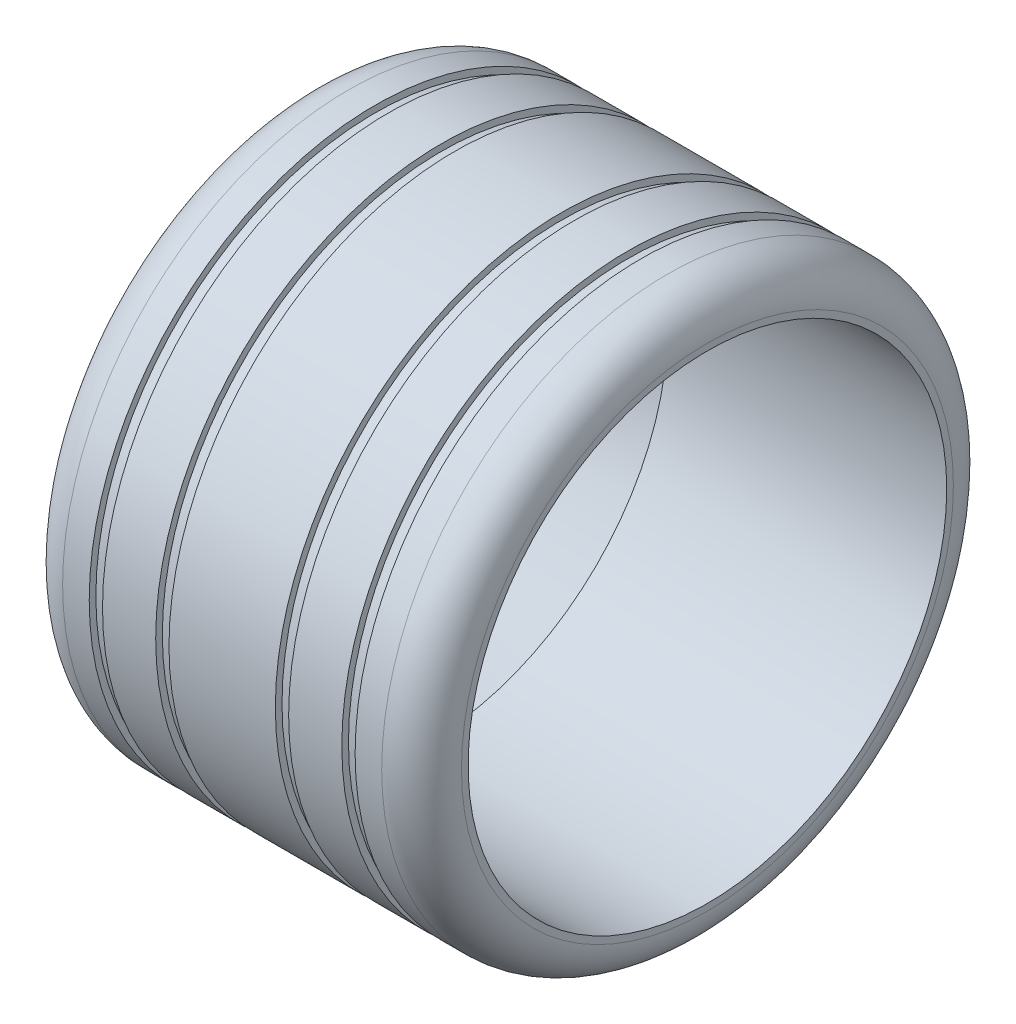
ISO-10303-21;
HEADER;
FILE_DESCRIPTION(('STEP AP214'),'2;1');
FILE_NAME('part.step','',(''),(''),'','','');
FILE_SCHEMA(('AUTOMOTIVE_DESIGN { 1 0 10303 214 1 1 1 1 }'));
ENDSEC;
DATA;
#1=APPLICATION_CONTEXT('core data for automotive mechanical design processes');
#2=APPLICATION_PROTOCOL_DEFINITION('international standard','automotive_design',2000,#1);
#3=PRODUCT_CONTEXT('',#1,'mechanical');
#4=PRODUCT('Part','Part','',(#3));
#5=PRODUCT_RELATED_PRODUCT_CATEGORY('part','',(#4));
#6=PRODUCT_DEFINITION_FORMATION('','',#4);
#7=PRODUCT_DEFINITION_CONTEXT('part definition',#1,'design');
#8=PRODUCT_DEFINITION('design','',#6,#7);
#9=PRODUCT_DEFINITION_SHAPE('','',#8);
#10=(LENGTH_UNIT() NAMED_UNIT(*) SI_UNIT(.MILLI.,.METRE.));
#11=(NAMED_UNIT(*) PLANE_ANGLE_UNIT() SI_UNIT($,.RADIAN.));
#12=(NAMED_UNIT(*) SI_UNIT($,.STERADIAN.) SOLID_ANGLE_UNIT());
#13=UNCERTAINTY_MEASURE_WITH_UNIT(LENGTH_MEASURE(1.E-05),#10,'distance_accuracy_value','');
#14=(GEOMETRIC_REPRESENTATION_CONTEXT(3) GLOBAL_UNCERTAINTY_ASSIGNED_CONTEXT((#13)) GLOBAL_UNIT_ASSIGNED_CONTEXT((#10,
#11,#12)) REPRESENTATION_CONTEXT('',''));
#15=CARTESIAN_POINT('',(0.,0.,0.));
#16=DIRECTION('',(0.,0.,1.));
#17=DIRECTION('',(1.,0.,0.));
#18=AXIS2_PLACEMENT_3D('',#15,#16,#17);
#19=CARTESIAN_POINT('',(30.,0.,0.));
#20=DIRECTION('',(-1.,0.,0.));
#21=DIRECTION('',(0.,0.,1.));
#22=AXIS2_PLACEMENT_3D('',#19,#20,#21);
#23=CYLINDRICAL_SURFACE('',#22,21.5);
#24=CARTESIAN_POINT('',(3.,0.,0.));
#25=DIRECTION('',(1.,0.,0.));
#26=DIRECTION('',(0.,0.,-1.));
#27=AXIS2_PLACEMENT_3D('',#24,#25,#26);
#28=CIRCLE('',#27,21.5);
#29=CARTESIAN_POINT('',(3.,0.,-21.5));
#30=VERTEX_POINT('',#29);
#31=EDGE_CURVE('E60',#30,#30,#28,.T.);
#32=ORIENTED_EDGE('',*,*,#31,.T.);
#33=EDGE_LOOP('',(#32));
#34=FACE_BOUND('',#33,.T.);
#35=CARTESIAN_POINT('',(5.,0.,0.));
#36=DIRECTION('',(-1.,0.,0.));
#37=DIRECTION('',(0.,0.,1.));
#38=AXIS2_PLACEMENT_3D('',#35,#36,#37);
#39=CIRCLE('',#38,21.5);
#40=CARTESIAN_POINT('',(5.,0.,21.5));
#41=VERTEX_POINT('',#40);
#42=EDGE_CURVE('E104',#41,#41,#39,.T.);
#43=ORIENTED_EDGE('',*,*,#42,.T.);
#44=EDGE_LOOP('',(#43));
#45=FACE_BOUND('',#44,.T.);
#46=ADVANCED_FACE('F39',(#34,#45),#23,.T.);
#47=CARTESIAN_POINT('',(27.,0.,0.));
#48=DIRECTION('',(1.,0.,0.));
#49=DIRECTION('',(0.,0.,-1.));
#50=AXIS2_PLACEMENT_3D('',#47,#48,#49);
#51=CIRCLE('',#50,21.5);
#52=CARTESIAN_POINT('',(27.,0.,-21.5));
#53=VERTEX_POINT('',#52);
#54=EDGE_CURVE('E63',#53,#53,#51,.F.);
#55=ORIENTED_EDGE('',*,*,#54,.T.);
#56=EDGE_LOOP('',(#55));
#57=FACE_BOUND('',#56,.T.);
#58=CARTESIAN_POINT('',(25.,0.,0.));
#59=DIRECTION('',(-1.,0.,0.));
#60=DIRECTION('',(0.,0.,1.));
#61=AXIS2_PLACEMENT_3D('',#58,#59,#60);
#62=CIRCLE('',#61,21.5);
#63=CARTESIAN_POINT('',(25.,0.,21.5));
#64=VERTEX_POINT('',#63);
#65=EDGE_CURVE('E92',#64,#64,#62,.T.);
#66=ORIENTED_EDGE('',*,*,#65,.F.);
#67=EDGE_LOOP('',(#66));
#68=FACE_BOUND('',#67,.T.);
#69=ADVANCED_FACE('F142',(#57,#68),#23,.T.);
#70=CARTESIAN_POINT('',(30.,0.,0.));
#71=DIRECTION('',(1.,0.,0.));
#72=DIRECTION('',(0.,0.,-1.));
#73=AXIS2_PLACEMENT_3D('',#70,#71,#72);
#74=PLANE('',#73);
#75=CARTESIAN_POINT('',(30.,0.,0.));
#76=DIRECTION('',(1.,0.,0.));
#77=DIRECTION('',(0.,0.,-1.));
#78=AXIS2_PLACEMENT_3D('',#75,#76,#77);
#79=CIRCLE('',#78,18.5);
#80=CARTESIAN_POINT('',(30.,0.,-18.5));
#81=VERTEX_POINT('',#80);
#82=EDGE_CURVE('E51',#81,#81,#79,.T.);
#83=ORIENTED_EDGE('',*,*,#82,.T.);
#84=EDGE_LOOP('',(#83));
#85=FACE_BOUND('',#84,.T.);
#86=CARTESIAN_POINT('',(30.,0.,0.));
#87=DIRECTION('',(1.,0.,0.));
#88=DIRECTION('',(0.,0.,-1.));
#89=AXIS2_PLACEMENT_3D('',#86,#87,#88);
#90=CIRCLE('',#89,18.);
#91=CARTESIAN_POINT('',(30.,0.,-18.));
#92=VERTEX_POINT('',#91);
#93=EDGE_CURVE('E66',#92,#92,#90,.T.);
#94=ORIENTED_EDGE('',*,*,#93,.F.);
#95=EDGE_LOOP('',(#94));
#96=FACE_BOUND('',#95,.T.);
#97=ADVANCED_FACE('F150',(#85,#96),#74,.T.);
#98=CARTESIAN_POINT('',(0.,0.,0.));
#99=DIRECTION('',(1.,0.,0.));
#100=DIRECTION('',(0.,0.,-1.));
#101=AXIS2_PLACEMENT_3D('',#98,#99,#100);
#102=PLANE('',#101);
#103=CARTESIAN_POINT('',(0.,0.,0.));
#104=DIRECTION('',(1.,0.,0.));
#105=DIRECTION('',(0.,0.,-1.));
#106=AXIS2_PLACEMENT_3D('',#103,#104,#105);
#107=CIRCLE('',#106,18.5);
#108=CARTESIAN_POINT('',(0.,0.,-18.5));
#109=VERTEX_POINT('',#108);
#110=EDGE_CURVE('E55',#109,#109,#107,.F.);
#111=ORIENTED_EDGE('',*,*,#110,.T.);
#112=EDGE_LOOP('',(#111));
#113=FACE_BOUND('',#112,.T.);
#114=CARTESIAN_POINT('',(0.,0.,0.));
#115=DIRECTION('',(-1.,0.,0.));
#116=DIRECTION('',(0.,0.,1.));
#117=AXIS2_PLACEMENT_3D('',#114,#115,#116);
#118=CIRCLE('',#117,10.5);
#119=CARTESIAN_POINT('',(0.,0.,10.5));
#120=VERTEX_POINT('',#119);
#121=EDGE_CURVE('E70',#120,#120,#118,.T.);
#122=ORIENTED_EDGE('',*,*,#121,.F.);
#123=EDGE_LOOP('',(#122));
#124=FACE_BOUND('',#123,.T.);
#125=ADVANCED_FACE('F203',(#113,#124),#102,.F.);
#126=CARTESIAN_POINT('',(5.,0.,0.));
#127=DIRECTION('',(1.,0.,0.));
#128=DIRECTION('',(0.,0.,-1.));
#129=AXIS2_PLACEMENT_3D('',#126,#127,#128);
#130=CYLINDRICAL_SURFACE('',#129,18.);
#131=CARTESIAN_POINT('',(8.99999999999997,0.,0.));
#132=DIRECTION('',(1.,0.,0.));
#133=DIRECTION('',(0.,0.,-1.));
#134=AXIS2_PLACEMENT_3D('',#131,#132,#133);
#135=CIRCLE('',#134,18.);
#136=CARTESIAN_POINT('',(8.99999999999997,0.,-18.));
#137=VERTEX_POINT('',#136);
#138=EDGE_CURVE('E10',#137,#137,#135,.F.);
#139=ORIENTED_EDGE('',*,*,#138,.T.);
#140=EDGE_LOOP('',(#139));
#141=FACE_BOUND('',#140,.T.);
#142=ORIENTED_EDGE('',*,*,#93,.T.);
#143=EDGE_LOOP('',(#142));
#144=FACE_BOUND('',#143,.T.);
#145=ADVANCED_FACE('F200',(#141,#144),#130,.F.);
#146=CARTESIAN_POINT('',(5.,0.,0.));
#147=DIRECTION('',(1.,0.,0.));
#148=DIRECTION('',(0.,0.,-1.));
#149=AXIS2_PLACEMENT_3D('',#146,#147,#148);
#150=PLANE('',#149);
#151=CARTESIAN_POINT('',(5.,0.,0.));
#152=DIRECTION('',(1.,0.,0.));
#153=DIRECTION('',(0.,0.,-1.));
#154=AXIS2_PLACEMENT_3D('',#151,#152,#153);
#155=CIRCLE('',#154,16.5441190629352);
#156=CARTESIAN_POINT('',(5.,0.,-16.5441190629352));
#157=VERTEX_POINT('',#156);
#158=EDGE_CURVE('E47',#157,#157,#155,.T.);
#159=ORIENTED_EDGE('',*,*,#158,.T.);
#160=EDGE_LOOP('',(#159));
#161=FACE_BOUND('',#160,.T.);
#162=CARTESIAN_POINT('',(5.,0.,0.));
#163=DIRECTION('',(1.,0.,0.));
#164=DIRECTION('',(0.,0.,-1.));
#165=AXIS2_PLACEMENT_3D('',#162,#163,#164);
#166=CIRCLE('',#165,10.5);
#167=CARTESIAN_POINT('',(5.,0.,-10.5));
#168=VERTEX_POINT('',#167);
#169=EDGE_CURVE('E67',#168,#168,#166,.T.);
#170=ORIENTED_EDGE('',*,*,#169,.F.);
#171=EDGE_LOOP('',(#170));
#172=FACE_BOUND('',#171,.T.);
#173=ADVANCED_FACE('F196',(#161,#172),#150,.T.);
#174=CARTESIAN_POINT('',(30.,0.,0.));
#175=DIRECTION('',(-1.,0.,0.));
#176=DIRECTION('',(0.,0.,1.));
#177=AXIS2_PLACEMENT_3D('',#174,#175,#176);
#178=CYLINDRICAL_SURFACE('',#177,10.5);
#179=ORIENTED_EDGE('',*,*,#169,.T.);
#180=EDGE_LOOP('',(#179));
#181=FACE_BOUND('',#180,.T.);
#182=ORIENTED_EDGE('',*,*,#121,.T.);
#183=EDGE_LOOP('',(#182));
#184=FACE_BOUND('',#183,.T.);
#185=ADVANCED_FACE('F192',(#181,#184),#178,.F.);
#186=CARTESIAN_POINT('',(3.,0.,0.));
#187=DIRECTION('',(1.,0.,0.));
#188=DIRECTION('',(0.,0.,-1.));
#189=AXIS2_PLACEMENT_3D('',#186,#187,#188);
#190=TOROIDAL_SURFACE('',#189,18.5,3.);
#191=ORIENTED_EDGE('',*,*,#110,.F.);
#192=EDGE_LOOP('',(#191));
#193=FACE_BOUND('',#192,.T.);
#194=ORIENTED_EDGE('',*,*,#31,.F.);
#195=EDGE_LOOP('',(#194));
#196=FACE_BOUND('',#195,.T.);
#197=ADVANCED_FACE('F195',(#193,#196),#190,.T.);
#198=CARTESIAN_POINT('',(27.,0.,0.));
#199=DIRECTION('',(1.,0.,0.));
#200=DIRECTION('',(0.,0.,-1.));
#201=AXIS2_PLACEMENT_3D('',#198,#199,#200);
#202=TOROIDAL_SURFACE('',#201,18.5,3.);
#203=ORIENTED_EDGE('',*,*,#54,.F.);
#204=EDGE_LOOP('',(#203));
#205=FACE_BOUND('',#204,.T.);
#206=ORIENTED_EDGE('',*,*,#82,.F.);
#207=EDGE_LOOP('',(#206));
#208=FACE_BOUND('',#207,.T.);
#209=ADVANCED_FACE('F217',(#205,#208),#202,.T.);
#210=CARTESIAN_POINT('',(24.,21.5,0.));
#211=DIRECTION('',(1.,0.,0.));
#212=DIRECTION('',(0.,0.,-1.));
#213=AXIS2_PLACEMENT_3D('',#210,#211,#212);
#214=PLANE('',#213);
#215=CARTESIAN_POINT('',(24.,0.,0.));
#216=DIRECTION('',(-1.,0.,0.));
#217=DIRECTION('',(0.,0.,1.));
#218=AXIS2_PLACEMENT_3D('',#215,#216,#217);
#219=CIRCLE('',#218,21.);
#220=CARTESIAN_POINT('',(24.,0.,21.));
#221=VERTEX_POINT('',#220);
#222=EDGE_CURVE('E105',#221,#221,#219,.T.);
#223=ORIENTED_EDGE('',*,*,#222,.T.);
#224=EDGE_LOOP('',(#223));
#225=FACE_BOUND('',#224,.T.);
#226=CARTESIAN_POINT('',(24.,0.,0.));
#227=DIRECTION('',(-1.,0.,0.));
#228=DIRECTION('',(0.,0.,1.));
#229=AXIS2_PLACEMENT_3D('',#226,#227,#228);
#230=CIRCLE('',#229,21.5);
#231=CARTESIAN_POINT('',(24.,0.,21.5));
#232=VERTEX_POINT('',#231);
#233=EDGE_CURVE('E101',#232,#232,#230,.T.);
#234=ORIENTED_EDGE('',*,*,#233,.F.);
#235=EDGE_LOOP('',(#234));
#236=FACE_BOUND('',#235,.T.);
#237=ADVANCED_FACE('F222',(#225,#236),#214,.T.);
#238=CARTESIAN_POINT('',(0.,0.,0.));
#239=DIRECTION('',(-1.,0.,0.));
#240=DIRECTION('',(0.,0.,1.));
#241=AXIS2_PLACEMENT_3D('',#238,#239,#240);
#242=CYLINDRICAL_SURFACE('',#241,21.);
#243=CARTESIAN_POINT('',(25.,0.,0.));
#244=DIRECTION('',(-1.,0.,0.));
#245=DIRECTION('',(0.,0.,1.));
#246=AXIS2_PLACEMENT_3D('',#243,#244,#245);
#247=CIRCLE('',#246,21.);
#248=CARTESIAN_POINT('',(25.,0.,21.));
#249=VERTEX_POINT('',#248);
#250=EDGE_CURVE('E108',#249,#249,#247,.T.);
#251=ORIENTED_EDGE('',*,*,#250,.T.);
#252=EDGE_LOOP('',(#251));
#253=FACE_BOUND('',#252,.T.);
#254=ORIENTED_EDGE('',*,*,#222,.F.);
#255=EDGE_LOOP('',(#254));
#256=FACE_BOUND('',#255,.T.);
#257=ADVANCED_FACE('F138',(#253,#256),#242,.T.);
#258=CARTESIAN_POINT('',(25.,21.5,0.));
#259=DIRECTION('',(-1.,0.,0.));
#260=DIRECTION('',(0.,0.,1.));
#261=AXIS2_PLACEMENT_3D('',#258,#259,#260);
#262=PLANE('',#261);
#263=ORIENTED_EDGE('',*,*,#65,.T.);
#264=EDGE_LOOP('',(#263));
#265=FACE_BOUND('',#264,.T.);
#266=ORIENTED_EDGE('',*,*,#250,.F.);
#267=EDGE_LOOP('',(#266));
#268=FACE_BOUND('',#267,.T.);
#269=ADVANCED_FACE('F128',(#265,#268),#262,.T.);
#270=CARTESIAN_POINT('',(5.,21.5,0.));
#271=DIRECTION('',(1.,0.,0.));
#272=DIRECTION('',(0.,0.,-1.));
#273=AXIS2_PLACEMENT_3D('',#270,#271,#272);
#274=PLANE('',#273);
#275=CARTESIAN_POINT('',(5.,0.,0.));
#276=DIRECTION('',(-1.,0.,0.));
#277=DIRECTION('',(0.,0.,1.));
#278=AXIS2_PLACEMENT_3D('',#275,#276,#277);
#279=CIRCLE('',#278,21.);
#280=CARTESIAN_POINT('',(5.,0.,21.));
#281=VERTEX_POINT('',#280);
#282=EDGE_CURVE('E75',#281,#281,#279,.T.);
#283=ORIENTED_EDGE('',*,*,#282,.T.);
#284=EDGE_LOOP('',(#283));
#285=FACE_BOUND('',#284,.T.);
#286=ORIENTED_EDGE('',*,*,#42,.F.);
#287=EDGE_LOOP('',(#286));
#288=FACE_BOUND('',#287,.T.);
#289=ADVANCED_FACE('F125',(#285,#288),#274,.T.);
#290=CARTESIAN_POINT('',(0.,0.,0.));
#291=DIRECTION('',(-1.,0.,0.));
#292=DIRECTION('',(0.,0.,1.));
#293=AXIS2_PLACEMENT_3D('',#290,#291,#292);
#294=CYLINDRICAL_SURFACE('',#293,21.);
#295=CARTESIAN_POINT('',(6.,0.,0.));
#296=DIRECTION('',(-1.,0.,0.));
#297=DIRECTION('',(0.,0.,1.));
#298=AXIS2_PLACEMENT_3D('',#295,#296,#297);
#299=CIRCLE('',#298,21.);
#300=CARTESIAN_POINT('',(6.,0.,21.));
#301=VERTEX_POINT('',#300);
#302=EDGE_CURVE('E115',#301,#301,#299,.T.);
#303=ORIENTED_EDGE('',*,*,#302,.T.);
#304=EDGE_LOOP('',(#303));
#305=FACE_BOUND('',#304,.T.);
#306=ORIENTED_EDGE('',*,*,#282,.F.);
#307=EDGE_LOOP('',(#306));
#308=FACE_BOUND('',#307,.T.);
#309=ADVANCED_FACE('F127',(#305,#308),#294,.T.);
#310=CARTESIAN_POINT('',(6.,21.5,0.));
#311=DIRECTION('',(-1.,0.,0.));
#312=DIRECTION('',(0.,0.,1.));
#313=AXIS2_PLACEMENT_3D('',#310,#311,#312);
#314=PLANE('',#313);
#315=CARTESIAN_POINT('',(6.,0.,0.));
#316=DIRECTION('',(-1.,0.,0.));
#317=DIRECTION('',(0.,0.,1.));
#318=AXIS2_PLACEMENT_3D('',#315,#316,#317);
#319=CIRCLE('',#318,21.5);
#320=CARTESIAN_POINT('',(6.,0.,21.5));
#321=VERTEX_POINT('',#320);
#322=EDGE_CURVE('E118',#321,#321,#319,.T.);
#323=ORIENTED_EDGE('',*,*,#322,.T.);
#324=EDGE_LOOP('',(#323));
#325=FACE_BOUND('',#324,.T.);
#326=ORIENTED_EDGE('',*,*,#302,.F.);
#327=EDGE_LOOP('',(#326));
#328=FACE_BOUND('',#327,.T.);
#329=ADVANCED_FACE('F135',(#325,#328),#314,.T.);
#330=CARTESIAN_POINT('',(10.,0.,0.));
#331=DIRECTION('',(-1.,0.,0.));
#332=DIRECTION('',(0.,0.,1.));
#333=AXIS2_PLACEMENT_3D('',#330,#331,#332);
#334=CIRCLE('',#333,21.5);
#335=CARTESIAN_POINT('',(10.,0.,21.5));
#336=VERTEX_POINT('',#335);
#337=EDGE_CURVE('E86',#336,#336,#334,.T.);
#338=ORIENTED_EDGE('',*,*,#337,.T.);
#339=EDGE_LOOP('',(#338));
#340=FACE_BOUND('',#339,.T.);
#341=ORIENTED_EDGE('',*,*,#322,.F.);
#342=EDGE_LOOP('',(#341));
#343=FACE_BOUND('',#342,.T.);
#344=ADVANCED_FACE('F145',(#340,#343),#23,.T.);
#345=CARTESIAN_POINT('',(11.,21.5,0.));
#346=DIRECTION('',(-1.,0.,0.));
#347=DIRECTION('',(0.,0.,1.));
#348=AXIS2_PLACEMENT_3D('',#345,#346,#347);
#349=PLANE('',#348);
#350=CARTESIAN_POINT('',(11.,0.,0.));
#351=DIRECTION('',(-1.,0.,0.));
#352=DIRECTION('',(0.,0.,1.));
#353=AXIS2_PLACEMENT_3D('',#350,#351,#352);
#354=CIRCLE('',#353,21.5);
#355=CARTESIAN_POINT('',(11.,0.,21.5));
#356=VERTEX_POINT('',#355);
#357=EDGE_CURVE('E76',#356,#356,#354,.T.);
#358=ORIENTED_EDGE('',*,*,#357,.T.);
#359=EDGE_LOOP('',(#358));
#360=FACE_BOUND('',#359,.T.);
#361=CARTESIAN_POINT('',(11.,0.,0.));
#362=DIRECTION('',(-1.,0.,0.));
#363=DIRECTION('',(0.,0.,1.));
#364=AXIS2_PLACEMENT_3D('',#361,#362,#363);
#365=CIRCLE('',#364,21.);
#366=CARTESIAN_POINT('',(11.,0.,21.));
#367=VERTEX_POINT('',#366);
#368=EDGE_CURVE('E80',#367,#367,#365,.T.);
#369=ORIENTED_EDGE('',*,*,#368,.F.);
#370=EDGE_LOOP('',(#369));
#371=FACE_BOUND('',#370,.T.);
#372=ADVANCED_FACE('F156',(#360,#371),#349,.T.);
#373=CARTESIAN_POINT('',(0.,0.,0.));
#374=DIRECTION('',(-1.,0.,0.));
#375=DIRECTION('',(0.,0.,1.));
#376=AXIS2_PLACEMENT_3D('',#373,#374,#375);
#377=CYLINDRICAL_SURFACE('',#376,21.);
#378=ORIENTED_EDGE('',*,*,#368,.T.);
#379=EDGE_LOOP('',(#378));
#380=FACE_BOUND('',#379,.T.);
#381=CARTESIAN_POINT('',(10.,0.,0.));
#382=DIRECTION('',(-1.,0.,0.));
#383=DIRECTION('',(0.,0.,1.));
#384=AXIS2_PLACEMENT_3D('',#381,#382,#383);
#385=CIRCLE('',#384,21.);
#386=CARTESIAN_POINT('',(10.,0.,21.));
#387=VERTEX_POINT('',#386);
#388=EDGE_CURVE('E83',#387,#387,#385,.T.);
#389=ORIENTED_EDGE('',*,*,#388,.F.);
#390=EDGE_LOOP('',(#389));
#391=FACE_BOUND('',#390,.T.);
#392=ADVANCED_FACE('F167',(#380,#391),#377,.T.);
#393=CARTESIAN_POINT('',(10.,21.5,0.));
#394=DIRECTION('',(1.,0.,0.));
#395=DIRECTION('',(0.,0.,-1.));
#396=AXIS2_PLACEMENT_3D('',#393,#394,#395);
#397=PLANE('',#396);
#398=ORIENTED_EDGE('',*,*,#388,.T.);
#399=EDGE_LOOP('',(#398));
#400=FACE_BOUND('',#399,.T.);
#401=ORIENTED_EDGE('',*,*,#337,.F.);
#402=EDGE_LOOP('',(#401));
#403=FACE_BOUND('',#402,.T.);
#404=ADVANCED_FACE('F159',(#400,#403),#397,.T.);
#405=ORIENTED_EDGE('',*,*,#357,.F.);
#406=EDGE_LOOP('',(#405));
#407=FACE_BOUND('',#406,.T.);
#408=CARTESIAN_POINT('',(19.,0.,0.));
#409=DIRECTION('',(-1.,0.,0.));
#410=DIRECTION('',(0.,0.,1.));
#411=AXIS2_PLACEMENT_3D('',#408,#409,#410);
#412=CIRCLE('',#411,21.5);
#413=CARTESIAN_POINT('',(19.,0.,21.5));
#414=VERTEX_POINT('',#413);
#415=EDGE_CURVE('E89',#414,#414,#412,.T.);
#416=ORIENTED_EDGE('',*,*,#415,.T.);
#417=EDGE_LOOP('',(#416));
#418=FACE_BOUND('',#417,.T.);
#419=ADVANCED_FACE('F146',(#407,#418),#23,.T.);
#420=CARTESIAN_POINT('',(20.,0.,0.));
#421=DIRECTION('',(-1.,0.,0.));
#422=DIRECTION('',(0.,0.,1.));
#423=AXIS2_PLACEMENT_3D('',#420,#421,#422);
#424=CIRCLE('',#423,21.5);
#425=CARTESIAN_POINT('',(20.,0.,21.5));
#426=VERTEX_POINT('',#425);
#427=EDGE_CURVE('E79',#426,#426,#424,.T.);
#428=ORIENTED_EDGE('',*,*,#427,.F.);
#429=EDGE_LOOP('',(#428));
#430=FACE_BOUND('',#429,.T.);
#431=ORIENTED_EDGE('',*,*,#233,.T.);
#432=EDGE_LOOP('',(#431));
#433=FACE_BOUND('',#432,.T.);
#434=ADVANCED_FACE('F152',(#430,#433),#23,.T.);
#435=CARTESIAN_POINT('',(19.,21.5,0.));
#436=DIRECTION('',(1.,0.,0.));
#437=DIRECTION('',(0.,0.,-1.));
#438=AXIS2_PLACEMENT_3D('',#435,#436,#437);
#439=PLANE('',#438);
#440=CARTESIAN_POINT('',(19.,0.,0.));
#441=DIRECTION('',(-1.,0.,0.));
#442=DIRECTION('',(0.,0.,1.));
#443=AXIS2_PLACEMENT_3D('',#440,#441,#442);
#444=CIRCLE('',#443,21.);
#445=CARTESIAN_POINT('',(19.,0.,21.));
#446=VERTEX_POINT('',#445);
#447=EDGE_CURVE('E93',#446,#446,#444,.T.);
#448=ORIENTED_EDGE('',*,*,#447,.T.);
#449=EDGE_LOOP('',(#448));
#450=FACE_BOUND('',#449,.T.);
#451=ORIENTED_EDGE('',*,*,#415,.F.);
#452=EDGE_LOOP('',(#451));
#453=FACE_BOUND('',#452,.T.);
#454=ADVANCED_FACE('F165',(#450,#453),#439,.T.);
#455=CARTESIAN_POINT('',(0.,0.,0.));
#456=DIRECTION('',(-1.,0.,0.));
#457=DIRECTION('',(0.,0.,1.));
#458=AXIS2_PLACEMENT_3D('',#455,#456,#457);
#459=CYLINDRICAL_SURFACE('',#458,21.);
#460=CARTESIAN_POINT('',(20.,0.,0.));
#461=DIRECTION('',(-1.,0.,0.));
#462=DIRECTION('',(0.,0.,1.));
#463=AXIS2_PLACEMENT_3D('',#460,#461,#462);
#464=CIRCLE('',#463,21.);
#465=CARTESIAN_POINT('',(20.,0.,21.));
#466=VERTEX_POINT('',#465);
#467=EDGE_CURVE('E96',#466,#466,#464,.T.);
#468=ORIENTED_EDGE('',*,*,#467,.T.);
#469=EDGE_LOOP('',(#468));
#470=FACE_BOUND('',#469,.T.);
#471=ORIENTED_EDGE('',*,*,#447,.F.);
#472=EDGE_LOOP('',(#471));
#473=FACE_BOUND('',#472,.T.);
#474=ADVANCED_FACE('F175',(#470,#473),#459,.T.);
#475=CARTESIAN_POINT('',(20.,21.5,0.));
#476=DIRECTION('',(-1.,0.,0.));
#477=DIRECTION('',(0.,0.,1.));
#478=AXIS2_PLACEMENT_3D('',#475,#476,#477);
#479=PLANE('',#478);
#480=ORIENTED_EDGE('',*,*,#427,.T.);
#481=EDGE_LOOP('',(#480));
#482=FACE_BOUND('',#481,.T.);
#483=ORIENTED_EDGE('',*,*,#467,.F.);
#484=EDGE_LOOP('',(#483));
#485=FACE_BOUND('',#484,.T.);
#486=ADVANCED_FACE('F181',(#482,#485),#479,.T.);
#487=CARTESIAN_POINT('',(5.,0.,0.));
#488=DIRECTION('',(1.,0.,0.));
#489=DIRECTION('',(0.,0.,-1.));
#490=AXIS2_PLACEMENT_3D('',#487,#488,#489);
#491=CONICAL_SURFACE('',#490,16.5441190629352,0.34906585039887);
#492=ORIENTED_EDGE('',*,*,#138,.F.);
#493=EDGE_LOOP('',(#492));
#494=FACE_BOUND('',#493,.T.);
#495=ORIENTED_EDGE('',*,*,#158,.F.);
#496=EDGE_LOOP('',(#495));
#497=FACE_BOUND('',#496,.T.);
#498=ADVANCED_FACE('F42',(#494,#497),#491,.F.);
#499=CLOSED_SHELL('',(#46,#69,#97,#125,#145,#173,#185,#197,#209,#237,#257,#269,#289,#309,#329,
#344,#372,#392,#404,#419,#434,#454,#474,#486,#498));
#500=MANIFOLD_SOLID_BREP('B2',#499);
#501=ADVANCED_BREP_SHAPE_REPRESENTATION('',(#18,#500),#14);
#502=SHAPE_DEFINITION_REPRESENTATION(#9,#501);
ENDSEC;
END-ISO-10303-21;
